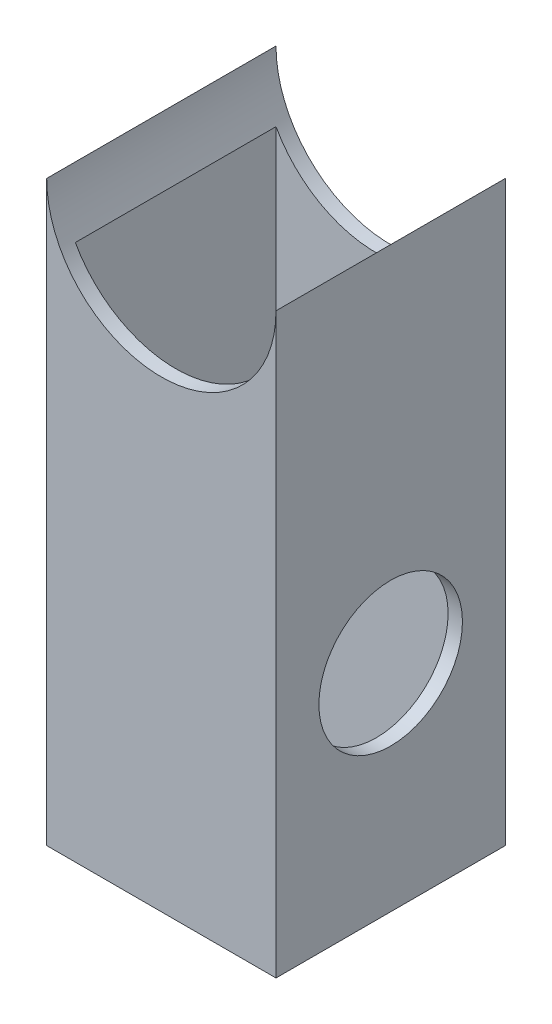
ISO-10303-21;
HEADER;
FILE_DESCRIPTION(('STEP AP214'),'2;1');
FILE_NAME('part.step','',(''),(''),'','','');
FILE_SCHEMA(('AUTOMOTIVE_DESIGN { 1 0 10303 214 1 1 1 1 }'));
ENDSEC;
DATA;
#1=APPLICATION_CONTEXT('core data for automotive mechanical design processes');
#2=APPLICATION_PROTOCOL_DEFINITION('international standard','automotive_design',2000,#1);
#3=PRODUCT_CONTEXT('',#1,'mechanical');
#4=PRODUCT('Part','Part','',(#3));
#5=PRODUCT_RELATED_PRODUCT_CATEGORY('part','',(#4));
#6=PRODUCT_DEFINITION_FORMATION('','',#4);
#7=PRODUCT_DEFINITION_CONTEXT('part definition',#1,'design');
#8=PRODUCT_DEFINITION('design','',#6,#7);
#9=PRODUCT_DEFINITION_SHAPE('','',#8);
#10=(LENGTH_UNIT() NAMED_UNIT(*) SI_UNIT(.MILLI.,.METRE.));
#11=(NAMED_UNIT(*) PLANE_ANGLE_UNIT() SI_UNIT($,.RADIAN.));
#12=(NAMED_UNIT(*) SI_UNIT($,.STERADIAN.) SOLID_ANGLE_UNIT());
#13=UNCERTAINTY_MEASURE_WITH_UNIT(LENGTH_MEASURE(1.E-05),#10,'distance_accuracy_value','');
#14=(GEOMETRIC_REPRESENTATION_CONTEXT(3) GLOBAL_UNCERTAINTY_ASSIGNED_CONTEXT((#13)) GLOBAL_UNIT_ASSIGNED_CONTEXT((#10,
#11,#12)) REPRESENTATION_CONTEXT('',''));
#15=CARTESIAN_POINT('',(0.,0.,0.));
#16=DIRECTION('',(0.,0.,1.));
#17=DIRECTION('',(1.,0.,0.));
#18=AXIS2_PLACEMENT_3D('',#15,#16,#17);
#19=CARTESIAN_POINT('',(0.,0.,0.));
#20=DIRECTION('',(0.,1.,0.));
#21=DIRECTION('',(0.,0.,1.));
#22=AXIS2_PLACEMENT_3D('',#19,#20,#21);
#23=PLANE('',#22);
#24=DIRECTION('',(0.,0.,-1.));
#25=VECTOR('',#24,1.);
#26=CARTESIAN_POINT('',(12.7,0.,12.7));
#27=LINE('',#26,#25);
#28=CARTESIAN_POINT('',(12.7,0.,12.7));
#29=VERTEX_POINT('',#28);
#30=CARTESIAN_POINT('',(12.7,0.,-12.7));
#31=VERTEX_POINT('',#30);
#32=EDGE_CURVE('E137',#29,#31,#27,.T.);
#33=ORIENTED_EDGE('',*,*,#32,.F.);
#34=DIRECTION('',(1.,0.,0.));
#35=VECTOR('',#34,1.);
#36=CARTESIAN_POINT('',(-12.7,0.,12.7));
#37=LINE('',#36,#35);
#38=CARTESIAN_POINT('',(-12.7,0.,12.7));
#39=VERTEX_POINT('',#38);
#40=EDGE_CURVE('E124',#39,#29,#37,.T.);
#41=ORIENTED_EDGE('',*,*,#40,.F.);
#42=DIRECTION('',(0.,0.,1.));
#43=VECTOR('',#42,1.);
#44=CARTESIAN_POINT('',(-12.7,0.,-12.7));
#45=LINE('',#44,#43);
#46=CARTESIAN_POINT('',(-12.7,0.,-12.7));
#47=VERTEX_POINT('',#46);
#48=EDGE_CURVE('E152',#47,#39,#45,.T.);
#49=ORIENTED_EDGE('',*,*,#48,.F.);
#50=DIRECTION('',(-1.,0.,0.));
#51=VECTOR('',#50,1.);
#52=CARTESIAN_POINT('',(12.7,0.,-12.7));
#53=LINE('',#52,#51);
#54=EDGE_CURVE('E155',#31,#47,#53,.T.);
#55=ORIENTED_EDGE('',*,*,#54,.F.);
#56=EDGE_LOOP('',(#33,#41,#49,#55));
#57=FACE_BOUND('',#56,.T.);
#58=DIRECTION('',(0.,0.,-1.));
#59=VECTOR('',#58,1.);
#60=CARTESIAN_POINT('',(11.1125,0.,11.1125));
#61=LINE('',#60,#59);
#62=CARTESIAN_POINT('',(11.1125,0.,11.1125));
#63=VERTEX_POINT('',#62);
#64=CARTESIAN_POINT('',(11.1125,0.,-11.1125));
#65=VERTEX_POINT('',#64);
#66=EDGE_CURVE('E185',#63,#65,#61,.T.);
#67=ORIENTED_EDGE('',*,*,#66,.T.);
#68=DIRECTION('',(-1.,0.,0.));
#69=VECTOR('',#68,1.);
#70=CARTESIAN_POINT('',(11.1125,0.,-11.1125));
#71=LINE('',#70,#69);
#72=CARTESIAN_POINT('',(-11.1125,0.,-11.1125));
#73=VERTEX_POINT('',#72);
#74=EDGE_CURVE('E181',#65,#73,#71,.T.);
#75=ORIENTED_EDGE('',*,*,#74,.T.);
#76=DIRECTION('',(0.,0.,1.));
#77=VECTOR('',#76,1.);
#78=CARTESIAN_POINT('',(-11.1125,0.,-11.1125));
#79=LINE('',#78,#77);
#80=CARTESIAN_POINT('',(-11.1125,0.,11.1125));
#81=VERTEX_POINT('',#80);
#82=EDGE_CURVE('E177',#73,#81,#79,.T.);
#83=ORIENTED_EDGE('',*,*,#82,.T.);
#84=DIRECTION('',(1.,0.,0.));
#85=VECTOR('',#84,1.);
#86=CARTESIAN_POINT('',(-11.1125,0.,11.1125));
#87=LINE('',#86,#85);
#88=EDGE_CURVE('E173',#81,#63,#87,.T.);
#89=ORIENTED_EDGE('',*,*,#88,.T.);
#90=EDGE_LOOP('',(#67,#75,#83,#89));
#91=FACE_BOUND('',#90,.T.);
#92=ADVANCED_FACE('F45',(#57,#91),#23,.F.);
#93=CARTESIAN_POINT('',(12.7,63.9989501845026,12.7));
#94=DIRECTION('',(-1.,0.,0.));
#95=DIRECTION('',(0.,0.,1.));
#96=AXIS2_PLACEMENT_3D('',#93,#94,#95);
#97=PLANE('',#96);
#98=CARTESIAN_POINT('',(12.7,23.8506,0.));
#99=DIRECTION('',(1.,0.,0.));
#100=DIRECTION('',(0.,0.,-1.));
#101=AXIS2_PLACEMENT_3D('',#98,#99,#100);
#102=CIRCLE('',#101,7.9502);
#103=CARTESIAN_POINT('',(12.7,23.8506,-7.9502));
#104=VERTEX_POINT('',#103);
#105=EDGE_CURVE('E202',#104,#104,#102,.T.);
#106=ORIENTED_EDGE('',*,*,#105,.F.);
#107=EDGE_LOOP('',(#106));
#108=FACE_BOUND('',#107,.T.);
#109=ORIENTED_EDGE('',*,*,#32,.T.);
#110=DIRECTION('',(0.,-1.,0.));
#111=VECTOR('',#110,1.);
#112=CARTESIAN_POINT('',(12.7,63.9989501845026,-12.7));
#113=LINE('',#112,#111);
#114=CARTESIAN_POINT('',(12.7,63.9989501845026,-12.7));
#115=VERTEX_POINT('',#114);
#116=EDGE_CURVE('E55',#115,#31,#113,.T.);
#117=ORIENTED_EDGE('',*,*,#116,.F.);
#118=DIRECTION('',(0.,0.,-1.));
#119=VECTOR('',#118,1.);
#120=CARTESIAN_POINT('',(12.7,63.9989501845026,12.7));
#121=LINE('',#120,#119);
#122=CARTESIAN_POINT('',(12.7,63.9989501845026,12.7));
#123=VERTEX_POINT('',#122);
#124=EDGE_CURVE('E111',#123,#115,#121,.T.);
#125=ORIENTED_EDGE('',*,*,#124,.F.);
#126=DIRECTION('',(0.,-1.,0.));
#127=VECTOR('',#126,1.);
#128=CARTESIAN_POINT('',(12.7,63.9989501845026,12.7));
#129=LINE('',#128,#127);
#130=EDGE_CURVE('E147',#123,#29,#129,.T.);
#131=ORIENTED_EDGE('',*,*,#130,.T.);
#132=EDGE_LOOP('',(#109,#117,#125,#131));
#133=FACE_BOUND('',#132,.T.);
#134=ADVANCED_FACE('F47',(#108,#133),#97,.F.);
#135=CARTESIAN_POINT('',(12.7,63.9989501845026,-12.7));
#136=DIRECTION('',(0.,0.,1.));
#137=DIRECTION('',(1.,0.,0.));
#138=AXIS2_PLACEMENT_3D('',#135,#136,#137);
#139=PLANE('',#138);
#140=DIRECTION('',(0.,-1.,0.));
#141=VECTOR('',#140,1.);
#142=CARTESIAN_POINT('',(-12.7,63.9989501845026,-12.7));
#143=LINE('',#142,#141);
#144=CARTESIAN_POINT('',(-12.7,63.9989501845026,-12.7));
#145=VERTEX_POINT('',#144);
#146=EDGE_CURVE('E131',#145,#47,#143,.T.);
#147=ORIENTED_EDGE('',*,*,#146,.F.);
#148=CARTESIAN_POINT('',(0.,63.9989501845026,-12.7));
#149=DIRECTION('',(0.,0.,1.));
#150=DIRECTION('',(1.,0.,0.));
#151=AXIS2_PLACEMENT_3D('',#148,#149,#150);
#152=CIRCLE('',#151,12.7);
#153=EDGE_CURVE('E114',#145,#115,#152,.T.);
#154=ORIENTED_EDGE('',*,*,#153,.T.);
#155=ORIENTED_EDGE('',*,*,#116,.T.);
#156=ORIENTED_EDGE('',*,*,#54,.T.);
#157=EDGE_LOOP('',(#147,#154,#155,#156));
#158=FACE_BOUND('',#157,.T.);
#159=ADVANCED_FACE('F128',(#158),#139,.F.);
#160=CARTESIAN_POINT('',(-12.7,63.9989501845026,-12.7));
#161=DIRECTION('',(1.,0.,0.));
#162=DIRECTION('',(0.,0.,-1.));
#163=AXIS2_PLACEMENT_3D('',#160,#161,#162);
#164=PLANE('',#163);
#165=CARTESIAN_POINT('',(-12.7,23.8506,0.));
#166=DIRECTION('',(1.,0.,0.));
#167=DIRECTION('',(0.,0.,-1.));
#168=AXIS2_PLACEMENT_3D('',#165,#166,#167);
#169=CIRCLE('',#168,7.9502);
#170=CARTESIAN_POINT('',(-12.7,23.8506,-7.95020000000001));
#171=VERTEX_POINT('',#170);
#172=EDGE_CURVE('E206',#171,#171,#169,.T.);
#173=ORIENTED_EDGE('',*,*,#172,.T.);
#174=EDGE_LOOP('',(#173));
#175=FACE_BOUND('',#174,.T.);
#176=ORIENTED_EDGE('',*,*,#48,.T.);
#177=DIRECTION('',(0.,-1.,0.));
#178=VECTOR('',#177,1.);
#179=CARTESIAN_POINT('',(-12.7,63.9989501845026,12.7));
#180=LINE('',#179,#178);
#181=CARTESIAN_POINT('',(-12.7,63.9989501845026,12.7));
#182=VERTEX_POINT('',#181);
#183=EDGE_CURVE('E141',#182,#39,#180,.T.);
#184=ORIENTED_EDGE('',*,*,#183,.F.);
#185=DIRECTION('',(0.,0.,1.));
#186=VECTOR('',#185,1.);
#187=CARTESIAN_POINT('',(-12.7,63.9989501845026,-12.7));
#188=LINE('',#187,#186);
#189=EDGE_CURVE('E123',#145,#182,#188,.T.);
#190=ORIENTED_EDGE('',*,*,#189,.F.);
#191=ORIENTED_EDGE('',*,*,#146,.T.);
#192=EDGE_LOOP('',(#176,#184,#190,#191));
#193=FACE_BOUND('',#192,.T.);
#194=ADVANCED_FACE('F245',(#175,#193),#164,.F.);
#195=CARTESIAN_POINT('',(-12.7,63.9989501845026,12.7));
#196=DIRECTION('',(0.,0.,-1.));
#197=DIRECTION('',(-1.,0.,0.));
#198=AXIS2_PLACEMENT_3D('',#195,#196,#197);
#199=PLANE('',#198);
#200=ORIENTED_EDGE('',*,*,#130,.F.);
#201=CARTESIAN_POINT('',(0.,63.9989501845026,12.7));
#202=DIRECTION('',(0.,0.,1.));
#203=DIRECTION('',(1.,0.,0.));
#204=AXIS2_PLACEMENT_3D('',#201,#202,#203);
#205=CIRCLE('',#204,12.7);
#206=EDGE_CURVE('E117',#182,#123,#205,.T.);
#207=ORIENTED_EDGE('',*,*,#206,.F.);
#208=ORIENTED_EDGE('',*,*,#183,.T.);
#209=ORIENTED_EDGE('',*,*,#40,.T.);
#210=EDGE_LOOP('',(#200,#207,#208,#209));
#211=FACE_BOUND('',#210,.T.);
#212=ADVANCED_FACE('F236',(#211),#199,.F.);
#213=CARTESIAN_POINT('',(11.1125,63.9989501845026,11.1125));
#214=DIRECTION('',(-1.,0.,0.));
#215=DIRECTION('',(0.,0.,1.));
#216=AXIS2_PLACEMENT_3D('',#213,#214,#215);
#217=PLANE('',#216);
#218=CARTESIAN_POINT('',(11.1125,23.8506,0.));
#219=DIRECTION('',(-1.,0.,0.));
#220=DIRECTION('',(0.,0.,1.));
#221=AXIS2_PLACEMENT_3D('',#218,#219,#220);
#222=CIRCLE('',#221,7.9502);
#223=CARTESIAN_POINT('',(11.1125,23.8506,7.95019999999999));
#224=VERTEX_POINT('',#223);
#225=EDGE_CURVE('E197',#224,#224,#222,.T.);
#226=ORIENTED_EDGE('',*,*,#225,.F.);
#227=EDGE_LOOP('',(#226));
#228=FACE_BOUND('',#227,.T.);
#229=DIRECTION('',(0.,0.,1.));
#230=VECTOR('',#229,1.);
#231=CARTESIAN_POINT('',(11.1125,57.8505891223983,-12.7));
#232=LINE('',#231,#230);
#233=CARTESIAN_POINT('',(11.1125,57.8505891223983,-11.1125));
#234=VERTEX_POINT('',#233);
#235=CARTESIAN_POINT('',(11.1125,57.8505891223983,11.1125));
#236=VERTEX_POINT('',#235);
#237=EDGE_CURVE('E61',#234,#236,#232,.T.);
#238=ORIENTED_EDGE('',*,*,#237,.F.);
#239=DIRECTION('',(0.,-1.,0.));
#240=VECTOR('',#239,1.);
#241=CARTESIAN_POINT('',(11.1125,63.9989501845026,-11.1125));
#242=LINE('',#241,#240);
#243=EDGE_CURVE('E160',#234,#65,#242,.T.);
#244=ORIENTED_EDGE('',*,*,#243,.T.);
#245=ORIENTED_EDGE('',*,*,#66,.F.);
#246=DIRECTION('',(0.,-1.,0.));
#247=VECTOR('',#246,1.);
#248=CARTESIAN_POINT('',(11.1125,63.9989501845026,11.1125));
#249=LINE('',#248,#247);
#250=EDGE_CURVE('E68',#236,#63,#249,.T.);
#251=ORIENTED_EDGE('',*,*,#250,.F.);
#252=EDGE_LOOP('',(#238,#244,#245,#251));
#253=FACE_BOUND('',#252,.T.);
#254=ADVANCED_FACE('F234',(#228,#253),#217,.T.);
#255=CARTESIAN_POINT('',(11.1125,63.9989501845026,-11.1125));
#256=DIRECTION('',(0.,0.,1.));
#257=DIRECTION('',(1.,0.,0.));
#258=AXIS2_PLACEMENT_3D('',#255,#256,#257);
#259=PLANE('',#258);
#260=CARTESIAN_POINT('',(0.,63.9989501845026,-11.1125));
#261=DIRECTION('',(0.,0.,1.));
#262=DIRECTION('',(1.,0.,0.));
#263=AXIS2_PLACEMENT_3D('',#260,#261,#262);
#264=CIRCLE('',#263,12.7);
#265=CARTESIAN_POINT('',(-11.1125,57.8505891223983,-11.1125));
#266=VERTEX_POINT('',#265);
#267=EDGE_CURVE('E191',#266,#234,#264,.T.);
#268=ORIENTED_EDGE('',*,*,#267,.F.);
#269=DIRECTION('',(0.,-1.,0.));
#270=VECTOR('',#269,1.);
#271=CARTESIAN_POINT('',(-11.1125,63.9989501845026,-11.1125));
#272=LINE('',#271,#270);
#273=EDGE_CURVE('E165',#266,#73,#272,.T.);
#274=ORIENTED_EDGE('',*,*,#273,.T.);
#275=ORIENTED_EDGE('',*,*,#74,.F.);
#276=ORIENTED_EDGE('',*,*,#243,.F.);
#277=EDGE_LOOP('',(#268,#274,#275,#276));
#278=FACE_BOUND('',#277,.T.);
#279=ADVANCED_FACE('F222',(#278),#259,.T.);
#280=CARTESIAN_POINT('',(-11.1125,63.9989501845026,-11.1125));
#281=DIRECTION('',(1.,0.,0.));
#282=DIRECTION('',(0.,0.,-1.));
#283=AXIS2_PLACEMENT_3D('',#280,#281,#282);
#284=PLANE('',#283);
#285=CARTESIAN_POINT('',(-11.1125,23.8506,0.));
#286=DIRECTION('',(1.,0.,0.));
#287=DIRECTION('',(0.,0.,-1.));
#288=AXIS2_PLACEMENT_3D('',#285,#286,#287);
#289=CIRCLE('',#288,7.9502);
#290=CARTESIAN_POINT('',(-11.1125,23.8506,-7.95020000000001));
#291=VERTEX_POINT('',#290);
#292=EDGE_CURVE('E49',#291,#291,#289,.T.);
#293=ORIENTED_EDGE('',*,*,#292,.F.);
#294=EDGE_LOOP('',(#293));
#295=FACE_BOUND('',#294,.T.);
#296=DIRECTION('',(0.,0.,1.));
#297=VECTOR('',#296,1.);
#298=CARTESIAN_POINT('',(-11.1125,57.8505891223983,-12.7));
#299=LINE('',#298,#297);
#300=CARTESIAN_POINT('',(-11.1125,57.8505891223983,11.1125));
#301=VERTEX_POINT('',#300);
#302=EDGE_CURVE('E134',#301,#266,#299,.F.);
#303=ORIENTED_EDGE('',*,*,#302,.F.);
#304=DIRECTION('',(0.,-1.,0.));
#305=VECTOR('',#304,1.);
#306=CARTESIAN_POINT('',(-11.1125,63.9989501845026,11.1125));
#307=LINE('',#306,#305);
#308=EDGE_CURVE('E168',#301,#81,#307,.T.);
#309=ORIENTED_EDGE('',*,*,#308,.T.);
#310=ORIENTED_EDGE('',*,*,#82,.F.);
#311=ORIENTED_EDGE('',*,*,#273,.F.);
#312=EDGE_LOOP('',(#303,#309,#310,#311));
#313=FACE_BOUND('',#312,.T.);
#314=ADVANCED_FACE('F218',(#295,#313),#284,.T.);
#315=CARTESIAN_POINT('',(-11.1125,63.9989501845026,11.1125));
#316=DIRECTION('',(0.,0.,-1.));
#317=DIRECTION('',(-1.,0.,0.));
#318=AXIS2_PLACEMENT_3D('',#315,#316,#317);
#319=PLANE('',#318);
#320=CARTESIAN_POINT('',(0.,63.9989501845026,11.1125));
#321=DIRECTION('',(0.,0.,-1.));
#322=DIRECTION('',(-1.,0.,0.));
#323=AXIS2_PLACEMENT_3D('',#320,#321,#322);
#324=CIRCLE('',#323,12.7);
#325=EDGE_CURVE('E11',#236,#301,#324,.T.);
#326=ORIENTED_EDGE('',*,*,#325,.F.);
#327=ORIENTED_EDGE('',*,*,#250,.T.);
#328=ORIENTED_EDGE('',*,*,#88,.F.);
#329=ORIENTED_EDGE('',*,*,#308,.F.);
#330=EDGE_LOOP('',(#326,#327,#328,#329));
#331=FACE_BOUND('',#330,.T.);
#332=ADVANCED_FACE('F221',(#331),#319,.T.);
#333=CARTESIAN_POINT('',(0.,63.9989501845026,-12.7));
#334=DIRECTION('',(0.,0.,1.));
#335=DIRECTION('',(1.,0.,0.));
#336=AXIS2_PLACEMENT_3D('',#333,#334,#335);
#337=CYLINDRICAL_SURFACE('',#336,12.7);
#338=ORIENTED_EDGE('',*,*,#237,.T.);
#339=ORIENTED_EDGE('',*,*,#325,.T.);
#340=ORIENTED_EDGE('',*,*,#302,.T.);
#341=ORIENTED_EDGE('',*,*,#267,.T.);
#342=EDGE_LOOP('',(#338,#339,#340,#341));
#343=FACE_BOUND('',#342,.T.);
#344=ORIENTED_EDGE('',*,*,#153,.F.);
#345=ORIENTED_EDGE('',*,*,#189,.T.);
#346=ORIENTED_EDGE('',*,*,#206,.T.);
#347=ORIENTED_EDGE('',*,*,#124,.T.);
#348=EDGE_LOOP('',(#344,#345,#346,#347));
#349=FACE_BOUND('',#348,.T.);
#350=ADVANCED_FACE('F113',(#343,#349),#337,.F.);
#351=CARTESIAN_POINT('',(-12.7,23.8506,0.));
#352=DIRECTION('',(1.,0.,0.));
#353=DIRECTION('',(0.,0.,-1.));
#354=AXIS2_PLACEMENT_3D('',#351,#352,#353);
#355=CYLINDRICAL_SURFACE('',#354,7.9502);
#356=ORIENTED_EDGE('',*,*,#292,.T.);
#357=EDGE_LOOP('',(#356));
#358=FACE_BOUND('',#357,.T.);
#359=ORIENTED_EDGE('',*,*,#172,.F.);
#360=EDGE_LOOP('',(#359));
#361=FACE_BOUND('',#360,.T.);
#362=ADVANCED_FACE('F215',(#358,#361),#355,.F.);
#363=ORIENTED_EDGE('',*,*,#225,.T.);
#364=EDGE_LOOP('',(#363));
#365=FACE_BOUND('',#364,.T.);
#366=ORIENTED_EDGE('',*,*,#105,.T.);
#367=EDGE_LOOP('',(#366));
#368=FACE_BOUND('',#367,.T.);
#369=ADVANCED_FACE('F317',(#365,#368),#355,.F.);
#370=CLOSED_SHELL('',(#92,#134,#159,#194,#212,#254,#279,#314,#332,#350,#362,#369));
#371=MANIFOLD_SOLID_BREP('B2',#370);
#372=ADVANCED_BREP_SHAPE_REPRESENTATION('',(#18,#371),#14);
#373=SHAPE_DEFINITION_REPRESENTATION(#9,#372);
ENDSEC;
END-ISO-10303-21;
